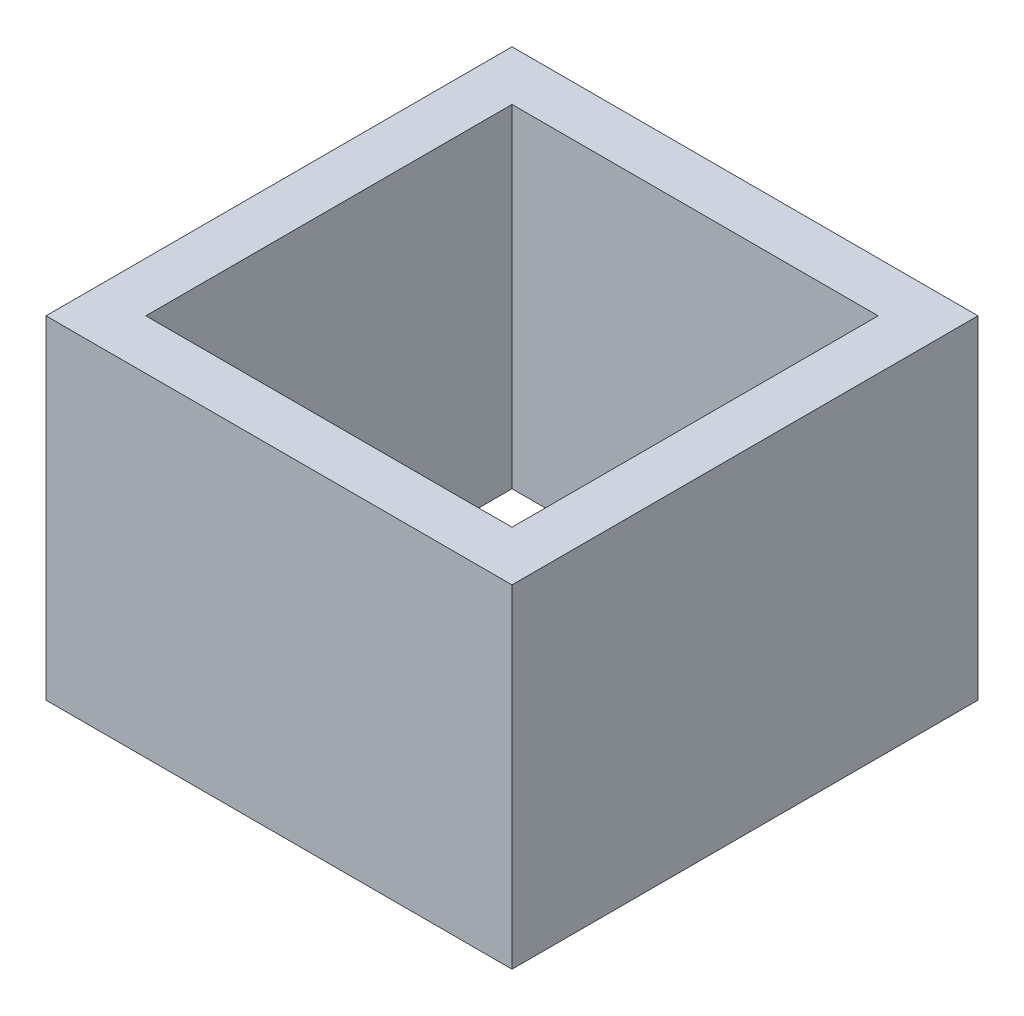
ISO-10303-21;
HEADER;
FILE_DESCRIPTION(('STEP AP214'),'2;1');
FILE_NAME('part.step','',(''),(''),'','','');
FILE_SCHEMA(('AUTOMOTIVE_DESIGN { 1 0 10303 214 1 1 1 1 }'));
ENDSEC;
DATA;
#1=APPLICATION_CONTEXT('core data for automotive mechanical design processes');
#2=APPLICATION_PROTOCOL_DEFINITION('international standard','automotive_design',2000,#1);
#3=PRODUCT_CONTEXT('',#1,'mechanical');
#4=PRODUCT('Part','Part','',(#3));
#5=PRODUCT_RELATED_PRODUCT_CATEGORY('part','',(#4));
#6=PRODUCT_DEFINITION_FORMATION('','',#4);
#7=PRODUCT_DEFINITION_CONTEXT('part definition',#1,'design');
#8=PRODUCT_DEFINITION('design','',#6,#7);
#9=PRODUCT_DEFINITION_SHAPE('','',#8);
#10=(LENGTH_UNIT() NAMED_UNIT(*) SI_UNIT(.MILLI.,.METRE.));
#11=(NAMED_UNIT(*) PLANE_ANGLE_UNIT() SI_UNIT($,.RADIAN.));
#12=(NAMED_UNIT(*) SI_UNIT($,.STERADIAN.) SOLID_ANGLE_UNIT());
#13=UNCERTAINTY_MEASURE_WITH_UNIT(LENGTH_MEASURE(1.E-05),#10,'distance_accuracy_value','');
#14=(GEOMETRIC_REPRESENTATION_CONTEXT(3) GLOBAL_UNCERTAINTY_ASSIGNED_CONTEXT((#13)) GLOBAL_UNIT_ASSIGNED_CONTEXT((#10,
#11,#12)) REPRESENTATION_CONTEXT('',''));
#15=CARTESIAN_POINT('',(0.,0.,0.));
#16=DIRECTION('',(0.,0.,1.));
#17=DIRECTION('',(1.,0.,0.));
#18=AXIS2_PLACEMENT_3D('',#15,#16,#17);
#19=CARTESIAN_POINT('',(-35.,-50.,35.));
#20=DIRECTION('',(0.,0.,1.));
#21=DIRECTION('',(1.,0.,0.));
#22=AXIS2_PLACEMENT_3D('',#19,#20,#21);
#23=PLANE('',#22);
#24=DIRECTION('',(1.,0.,0.));
#25=VECTOR('',#24,1.);
#26=CARTESIAN_POINT('',(-35.,0.,35.));
#27=LINE('',#26,#25);
#28=CARTESIAN_POINT('',(-35.,0.,35.));
#29=VERTEX_POINT('',#28);
#30=CARTESIAN_POINT('',(35.,0.,35.));
#31=VERTEX_POINT('',#30);
#32=EDGE_CURVE('E133',#29,#31,#27,.T.);
#33=ORIENTED_EDGE('',*,*,#32,.F.);
#34=DIRECTION('',(0.,1.,0.));
#35=VECTOR('',#34,1.);
#36=CARTESIAN_POINT('',(-35.,-50.,35.));
#37=LINE('',#36,#35);
#38=CARTESIAN_POINT('',(-35.,-50.,35.));
#39=VERTEX_POINT('',#38);
#40=EDGE_CURVE('E11',#39,#29,#37,.T.);
#41=ORIENTED_EDGE('',*,*,#40,.F.);
#42=DIRECTION('',(1.,0.,0.));
#43=VECTOR('',#42,1.);
#44=CARTESIAN_POINT('',(-35.,-50.,35.));
#45=LINE('',#44,#43);
#46=CARTESIAN_POINT('',(35.,-50.,35.));
#47=VERTEX_POINT('',#46);
#48=EDGE_CURVE('E137',#39,#47,#45,.T.);
#49=ORIENTED_EDGE('',*,*,#48,.T.);
#50=DIRECTION('',(0.,1.,0.));
#51=VECTOR('',#50,1.);
#52=CARTESIAN_POINT('',(35.,-50.,35.));
#53=LINE('',#52,#51);
#54=EDGE_CURVE('E38',#47,#31,#53,.T.);
#55=ORIENTED_EDGE('',*,*,#54,.T.);
#56=EDGE_LOOP('',(#33,#41,#49,#55));
#57=FACE_BOUND('',#56,.T.);
#58=ADVANCED_FACE('F35',(#57),#23,.T.);
#59=CARTESIAN_POINT('',(-35.,-50.,35.));
#60=DIRECTION('',(1.,0.,0.));
#61=DIRECTION('',(0.,0.,-1.));
#62=AXIS2_PLACEMENT_3D('',#59,#60,#61);
#63=PLANE('',#62);
#64=DIRECTION('',(0.,0.,-1.));
#65=VECTOR('',#64,1.);
#66=CARTESIAN_POINT('',(-35.,0.,35.));
#67=LINE('',#66,#65);
#68=CARTESIAN_POINT('',(-35.,0.,-35.));
#69=VERTEX_POINT('',#68);
#70=EDGE_CURVE('E141',#29,#69,#67,.T.);
#71=ORIENTED_EDGE('',*,*,#70,.T.);
#72=DIRECTION('',(0.,1.,0.));
#73=VECTOR('',#72,1.);
#74=CARTESIAN_POINT('',(-35.,-50.,-35.));
#75=LINE('',#74,#73);
#76=CARTESIAN_POINT('',(-35.,-50.,-35.));
#77=VERTEX_POINT('',#76);
#78=EDGE_CURVE('E43',#77,#69,#75,.T.);
#79=ORIENTED_EDGE('',*,*,#78,.F.);
#80=DIRECTION('',(0.,0.,-1.));
#81=VECTOR('',#80,1.);
#82=CARTESIAN_POINT('',(-35.,-50.,35.));
#83=LINE('',#82,#81);
#84=EDGE_CURVE('E146',#39,#77,#83,.T.);
#85=ORIENTED_EDGE('',*,*,#84,.F.);
#86=ORIENTED_EDGE('',*,*,#40,.T.);
#87=EDGE_LOOP('',(#71,#79,#85,#86));
#88=FACE_BOUND('',#87,.T.);
#89=ADVANCED_FACE('F173',(#88),#63,.F.);
#90=CARTESIAN_POINT('',(-35.,-50.,-35.));
#91=DIRECTION('',(0.,0.,1.));
#92=DIRECTION('',(1.,0.,0.));
#93=AXIS2_PLACEMENT_3D('',#90,#91,#92);
#94=PLANE('',#93);
#95=DIRECTION('',(1.,0.,0.));
#96=VECTOR('',#95,1.);
#97=CARTESIAN_POINT('',(-35.,0.,-35.));
#98=LINE('',#97,#96);
#99=CARTESIAN_POINT('',(35.,0.,-35.));
#100=VERTEX_POINT('',#99);
#101=EDGE_CURVE('E153',#69,#100,#98,.T.);
#102=ORIENTED_EDGE('',*,*,#101,.T.);
#103=DIRECTION('',(0.,1.,0.));
#104=VECTOR('',#103,1.);
#105=CARTESIAN_POINT('',(35.,-50.,-35.));
#106=LINE('',#105,#104);
#107=CARTESIAN_POINT('',(35.,-50.,-35.));
#108=VERTEX_POINT('',#107);
#109=EDGE_CURVE('E158',#108,#100,#106,.T.);
#110=ORIENTED_EDGE('',*,*,#109,.F.);
#111=DIRECTION('',(1.,0.,0.));
#112=VECTOR('',#111,1.);
#113=CARTESIAN_POINT('',(-35.,-50.,-35.));
#114=LINE('',#113,#112);
#115=EDGE_CURVE('E144',#77,#108,#114,.T.);
#116=ORIENTED_EDGE('',*,*,#115,.F.);
#117=ORIENTED_EDGE('',*,*,#78,.T.);
#118=EDGE_LOOP('',(#102,#110,#116,#117));
#119=FACE_BOUND('',#118,.T.);
#120=ADVANCED_FACE('F177',(#119),#94,.F.);
#121=CARTESIAN_POINT('',(35.,-50.,35.));
#122=DIRECTION('',(1.,0.,0.));
#123=DIRECTION('',(0.,0.,-1.));
#124=AXIS2_PLACEMENT_3D('',#121,#122,#123);
#125=PLANE('',#124);
#126=DIRECTION('',(0.,0.,-1.));
#127=VECTOR('',#126,1.);
#128=CARTESIAN_POINT('',(35.,0.,35.));
#129=LINE('',#128,#127);
#130=EDGE_CURVE('E150',#31,#100,#129,.T.);
#131=ORIENTED_EDGE('',*,*,#130,.F.);
#132=ORIENTED_EDGE('',*,*,#54,.F.);
#133=DIRECTION('',(0.,0.,-1.));
#134=VECTOR('',#133,1.);
#135=CARTESIAN_POINT('',(35.,-50.,35.));
#136=LINE('',#135,#134);
#137=EDGE_CURVE('E140',#47,#108,#136,.T.);
#138=ORIENTED_EDGE('',*,*,#137,.T.);
#139=ORIENTED_EDGE('',*,*,#109,.T.);
#140=EDGE_LOOP('',(#131,#132,#138,#139));
#141=FACE_BOUND('',#140,.T.);
#142=ADVANCED_FACE('F166',(#141),#125,.T.);
#143=CARTESIAN_POINT('',(0.,-50.,0.));
#144=DIRECTION('',(0.,1.,0.));
#145=DIRECTION('',(0.,0.,1.));
#146=AXIS2_PLACEMENT_3D('',#143,#144,#145);
#147=PLANE('',#146);
#148=DIRECTION('',(1.,0.,0.));
#149=VECTOR('',#148,1.);
#150=CARTESIAN_POINT('',(-27.5,-50.,27.5));
#151=LINE('',#150,#149);
#152=CARTESIAN_POINT('',(-27.5,-50.,27.5));
#153=VERTEX_POINT('',#152);
#154=CARTESIAN_POINT('',(27.5,-50.,27.5));
#155=VERTEX_POINT('',#154);
#156=EDGE_CURVE('E108',#153,#155,#151,.T.);
#157=ORIENTED_EDGE('',*,*,#156,.T.);
#158=DIRECTION('',(0.,0.,-1.));
#159=VECTOR('',#158,1.);
#160=CARTESIAN_POINT('',(27.5,-50.,-27.5));
#161=LINE('',#160,#159);
#162=CARTESIAN_POINT('',(27.5,-50.,-27.5));
#163=VERTEX_POINT('',#162);
#164=EDGE_CURVE('E102',#155,#163,#161,.T.);
#165=ORIENTED_EDGE('',*,*,#164,.T.);
#166=DIRECTION('',(-1.,0.,0.));
#167=VECTOR('',#166,1.);
#168=CARTESIAN_POINT('',(-27.5,-50.,-27.5));
#169=LINE('',#168,#167);
#170=CARTESIAN_POINT('',(-27.5,-50.,-27.5));
#171=VERTEX_POINT('',#170);
#172=EDGE_CURVE('E111',#163,#171,#169,.T.);
#173=ORIENTED_EDGE('',*,*,#172,.T.);
#174=DIRECTION('',(0.,0.,1.));
#175=VECTOR('',#174,1.);
#176=CARTESIAN_POINT('',(-27.5,-50.,-27.5));
#177=LINE('',#176,#175);
#178=EDGE_CURVE('E51',#171,#153,#177,.T.);
#179=ORIENTED_EDGE('',*,*,#178,.T.);
#180=EDGE_LOOP('',(#157,#165,#173,#179));
#181=FACE_BOUND('',#180,.T.);
#182=ORIENTED_EDGE('',*,*,#48,.F.);
#183=ORIENTED_EDGE('',*,*,#84,.T.);
#184=ORIENTED_EDGE('',*,*,#115,.T.);
#185=ORIENTED_EDGE('',*,*,#137,.F.);
#186=EDGE_LOOP('',(#182,#183,#184,#185));
#187=FACE_BOUND('',#186,.T.);
#188=ADVANCED_FACE('F115',(#181,#187),#147,.F.);
#189=CARTESIAN_POINT('',(0.,0.,0.));
#190=DIRECTION('',(0.,1.,0.));
#191=DIRECTION('',(0.,0.,1.));
#192=AXIS2_PLACEMENT_3D('',#189,#190,#191);
#193=PLANE('',#192);
#194=DIRECTION('',(0.,0.,-1.));
#195=VECTOR('',#194,1.);
#196=CARTESIAN_POINT('',(27.5,0.,-27.5));
#197=LINE('',#196,#195);
#198=CARTESIAN_POINT('',(27.5,0.,27.5));
#199=VERTEX_POINT('',#198);
#200=CARTESIAN_POINT('',(27.5,0.,-27.5));
#201=VERTEX_POINT('',#200);
#202=EDGE_CURVE('E59',#199,#201,#197,.T.);
#203=ORIENTED_EDGE('',*,*,#202,.F.);
#204=DIRECTION('',(1.,0.,0.));
#205=VECTOR('',#204,1.);
#206=CARTESIAN_POINT('',(-27.5,0.,27.5));
#207=LINE('',#206,#205);
#208=CARTESIAN_POINT('',(-27.5,0.,27.5));
#209=VERTEX_POINT('',#208);
#210=EDGE_CURVE('E118',#209,#199,#207,.T.);
#211=ORIENTED_EDGE('',*,*,#210,.F.);
#212=DIRECTION('',(0.,0.,1.));
#213=VECTOR('',#212,1.);
#214=CARTESIAN_POINT('',(-27.5,0.,-27.5));
#215=LINE('',#214,#213);
#216=CARTESIAN_POINT('',(-27.5,0.,-27.5));
#217=VERTEX_POINT('',#216);
#218=EDGE_CURVE('E121',#217,#209,#215,.T.);
#219=ORIENTED_EDGE('',*,*,#218,.F.);
#220=DIRECTION('',(-1.,0.,0.));
#221=VECTOR('',#220,1.);
#222=CARTESIAN_POINT('',(-27.5,0.,-27.5));
#223=LINE('',#222,#221);
#224=EDGE_CURVE('E127',#201,#217,#223,.T.);
#225=ORIENTED_EDGE('',*,*,#224,.F.);
#226=EDGE_LOOP('',(#203,#211,#219,#225));
#227=FACE_BOUND('',#226,.T.);
#228=ORIENTED_EDGE('',*,*,#32,.T.);
#229=ORIENTED_EDGE('',*,*,#130,.T.);
#230=ORIENTED_EDGE('',*,*,#101,.F.);
#231=ORIENTED_EDGE('',*,*,#70,.F.);
#232=EDGE_LOOP('',(#228,#229,#230,#231));
#233=FACE_BOUND('',#232,.T.);
#234=ADVANCED_FACE('F170',(#227,#233),#193,.T.);
#235=CARTESIAN_POINT('',(27.5,-50.,-27.5));
#236=DIRECTION('',(1.,0.,0.));
#237=DIRECTION('',(0.,0.,-1.));
#238=AXIS2_PLACEMENT_3D('',#235,#236,#237);
#239=PLANE('',#238);
#240=ORIENTED_EDGE('',*,*,#202,.T.);
#241=DIRECTION('',(0.,1.,0.));
#242=VECTOR('',#241,1.);
#243=CARTESIAN_POINT('',(27.5,-50.,-27.5));
#244=LINE('',#243,#242);
#245=EDGE_CURVE('E98',#163,#201,#244,.T.);
#246=ORIENTED_EDGE('',*,*,#245,.F.);
#247=ORIENTED_EDGE('',*,*,#164,.F.);
#248=DIRECTION('',(0.,1.,0.));
#249=VECTOR('',#248,1.);
#250=CARTESIAN_POINT('',(27.5,-50.,27.5));
#251=LINE('',#250,#249);
#252=EDGE_CURVE('E131',#155,#199,#251,.T.);
#253=ORIENTED_EDGE('',*,*,#252,.T.);
#254=EDGE_LOOP('',(#240,#246,#247,#253));
#255=FACE_BOUND('',#254,.T.);
#256=ADVANCED_FACE('F100',(#255),#239,.F.);
#257=CARTESIAN_POINT('',(-27.5,-50.,27.5));
#258=DIRECTION('',(0.,0.,1.));
#259=DIRECTION('',(1.,0.,0.));
#260=AXIS2_PLACEMENT_3D('',#257,#258,#259);
#261=PLANE('',#260);
#262=ORIENTED_EDGE('',*,*,#210,.T.);
#263=ORIENTED_EDGE('',*,*,#252,.F.);
#264=ORIENTED_EDGE('',*,*,#156,.F.);
#265=DIRECTION('',(0.,1.,0.));
#266=VECTOR('',#265,1.);
#267=CARTESIAN_POINT('',(-27.5,-50.,27.5));
#268=LINE('',#267,#266);
#269=EDGE_CURVE('E134',#153,#209,#268,.T.);
#270=ORIENTED_EDGE('',*,*,#269,.T.);
#271=EDGE_LOOP('',(#262,#263,#264,#270));
#272=FACE_BOUND('',#271,.T.);
#273=ADVANCED_FACE('F221',(#272),#261,.F.);
#274=CARTESIAN_POINT('',(-27.5,-50.,-27.5));
#275=DIRECTION('',(-1.,0.,0.));
#276=DIRECTION('',(0.,0.,1.));
#277=AXIS2_PLACEMENT_3D('',#274,#275,#276);
#278=PLANE('',#277);
#279=ORIENTED_EDGE('',*,*,#218,.T.);
#280=ORIENTED_EDGE('',*,*,#269,.F.);
#281=ORIENTED_EDGE('',*,*,#178,.F.);
#282=DIRECTION('',(0.,1.,0.));
#283=VECTOR('',#282,1.);
#284=CARTESIAN_POINT('',(-27.5,-50.,-27.5));
#285=LINE('',#284,#283);
#286=EDGE_CURVE('E107',#171,#217,#285,.T.);
#287=ORIENTED_EDGE('',*,*,#286,.T.);
#288=EDGE_LOOP('',(#279,#280,#281,#287));
#289=FACE_BOUND('',#288,.T.);
#290=ADVANCED_FACE('F229',(#289),#278,.F.);
#291=CARTESIAN_POINT('',(-27.5,-50.,-27.5));
#292=DIRECTION('',(0.,0.,-1.));
#293=DIRECTION('',(-1.,0.,0.));
#294=AXIS2_PLACEMENT_3D('',#291,#292,#293);
#295=PLANE('',#294);
#296=ORIENTED_EDGE('',*,*,#224,.T.);
#297=ORIENTED_EDGE('',*,*,#286,.F.);
#298=ORIENTED_EDGE('',*,*,#172,.F.);
#299=ORIENTED_EDGE('',*,*,#245,.T.);
#300=EDGE_LOOP('',(#296,#297,#298,#299));
#301=FACE_BOUND('',#300,.T.);
#302=ADVANCED_FACE('F112',(#301),#295,.F.);
#303=CLOSED_SHELL('',(#58,#89,#120,#142,#188,#234,#256,#273,#290,#302));
#304=MANIFOLD_SOLID_BREP('B2',#303);
#305=ADVANCED_BREP_SHAPE_REPRESENTATION('',(#18,#304),#14);
#306=SHAPE_DEFINITION_REPRESENTATION(#9,#305);
ENDSEC;
END-ISO-10303-21;
